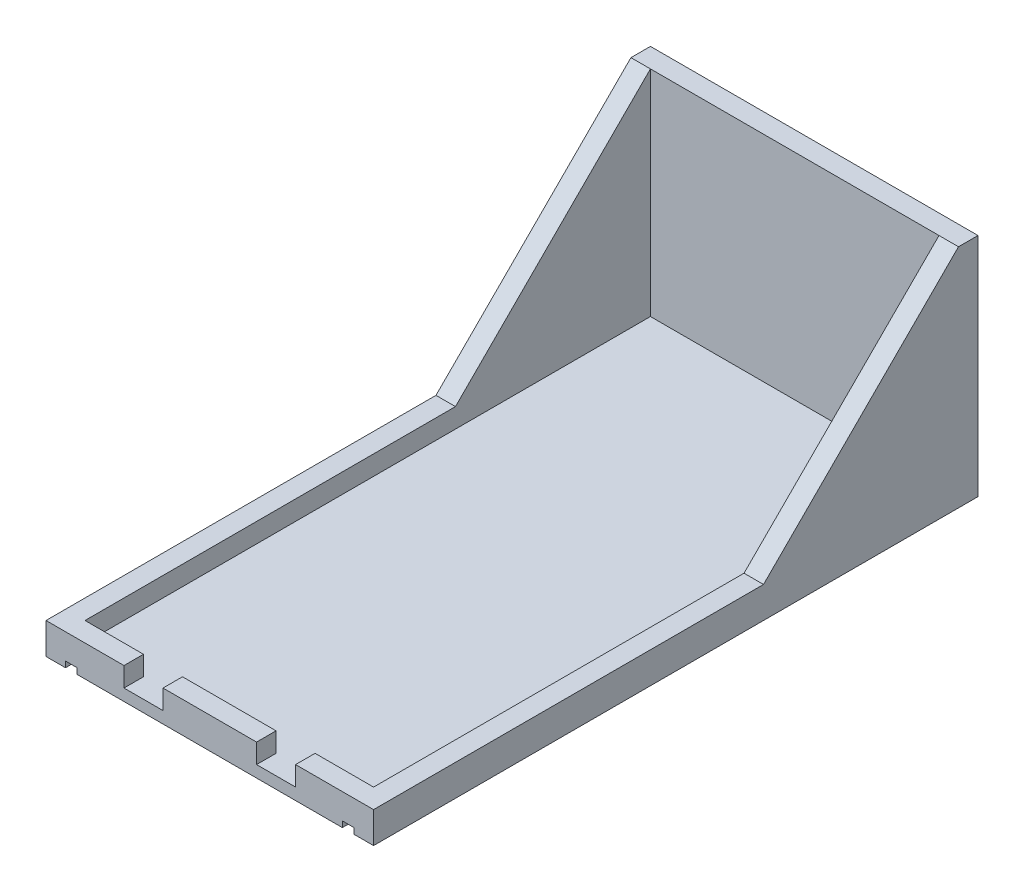
ISO-10303-21;
HEADER;
FILE_DESCRIPTION(('STEP AP214'),'2;1');
FILE_NAME('part.step','',(''),(''),'','','');
FILE_SCHEMA(('AUTOMOTIVE_DESIGN { 1 0 10303 214 1 1 1 1 }'));
ENDSEC;
DATA;
#1=APPLICATION_CONTEXT('core data for automotive mechanical design processes');
#2=APPLICATION_PROTOCOL_DEFINITION('international standard','automotive_design',2000,#1);
#3=PRODUCT_CONTEXT('',#1,'mechanical');
#4=PRODUCT('Part','Part','',(#3));
#5=PRODUCT_RELATED_PRODUCT_CATEGORY('part','',(#4));
#6=PRODUCT_DEFINITION_FORMATION('','',#4);
#7=PRODUCT_DEFINITION_CONTEXT('part definition',#1,'design');
#8=PRODUCT_DEFINITION('design','',#6,#7);
#9=PRODUCT_DEFINITION_SHAPE('','',#8);
#10=(LENGTH_UNIT() NAMED_UNIT(*) SI_UNIT(.MILLI.,.METRE.));
#11=(NAMED_UNIT(*) PLANE_ANGLE_UNIT() SI_UNIT($,.RADIAN.));
#12=(NAMED_UNIT(*) SI_UNIT($,.STERADIAN.) SOLID_ANGLE_UNIT());
#13=UNCERTAINTY_MEASURE_WITH_UNIT(LENGTH_MEASURE(1.E-05),#10,'distance_accuracy_value','');
#14=(GEOMETRIC_REPRESENTATION_CONTEXT(3) GLOBAL_UNCERTAINTY_ASSIGNED_CONTEXT((#13)) GLOBAL_UNIT_ASSIGNED_CONTEXT((#10,
#11,#12)) REPRESENTATION_CONTEXT('',''));
#15=CARTESIAN_POINT('',(0.,0.,0.));
#16=DIRECTION('',(0.,0.,1.));
#17=DIRECTION('',(1.,0.,0.));
#18=AXIS2_PLACEMENT_3D('',#15,#16,#17);
#19=CARTESIAN_POINT('',(37.,0.,72.5));
#20=DIRECTION('',(0.,0.,1.));
#21=DIRECTION('',(1.,0.,0.));
#22=AXIS2_PLACEMENT_3D('',#19,#20,#21);
#23=PLANE('',#22);
#24=DIRECTION('',(1.,0.,0.));
#25=VECTOR('',#24,1.);
#26=CARTESIAN_POINT('',(34.,1.5,72.5));
#27=LINE('',#26,#25);
#28=CARTESIAN_POINT('',(34.,1.5,72.5));
#29=VERTEX_POINT('',#28);
#30=CARTESIAN_POINT('',(37.,1.5,72.5));
#31=VERTEX_POINT('',#30);
#32=EDGE_CURVE('E244',#29,#31,#27,.T.);
#33=ORIENTED_EDGE('',*,*,#32,.F.);
#34=DIRECTION('',(0.,1.,0.));
#35=VECTOR('',#34,1.);
#36=CARTESIAN_POINT('',(34.,0.,72.5));
#37=LINE('',#36,#35);
#38=CARTESIAN_POINT('',(34.,3.,72.5));
#39=VERTEX_POINT('',#38);
#40=EDGE_CURVE('E257',#29,#39,#37,.T.);
#41=ORIENTED_EDGE('',*,*,#40,.T.);
#42=DIRECTION('',(1.,0.,0.));
#43=VECTOR('',#42,1.);
#44=CARTESIAN_POINT('',(0.,3.,72.5));
#45=LINE('',#44,#43);
#46=CARTESIAN_POINT('',(22.,3.,72.5));
#47=VERTEX_POINT('',#46);
#48=EDGE_CURVE('E310',#47,#39,#45,.T.);
#49=ORIENTED_EDGE('',*,*,#48,.F.);
#50=DIRECTION('',(0.,1.,0.));
#51=VECTOR('',#50,1.);
#52=CARTESIAN_POINT('',(22.,3.,72.5));
#53=LINE('',#52,#51);
#54=CARTESIAN_POINT('',(22.,8.,72.5));
#55=VERTEX_POINT('',#54);
#56=EDGE_CURVE('E302',#47,#55,#53,.T.);
#57=ORIENTED_EDGE('',*,*,#56,.T.);
#58=DIRECTION('',(-1.,0.,0.));
#59=VECTOR('',#58,1.);
#60=CARTESIAN_POINT('',(42.,8.,72.5));
#61=LINE('',#60,#59);
#62=CARTESIAN_POINT('',(37.,8.,72.5));
#63=VERTEX_POINT('',#62);
#64=EDGE_CURVE('E254',#63,#55,#61,.T.);
#65=ORIENTED_EDGE('',*,*,#64,.F.);
#66=DIRECTION('',(0.,1.,0.));
#67=VECTOR('',#66,1.);
#68=CARTESIAN_POINT('',(37.,0.,72.5));
#69=LINE('',#68,#67);
#70=EDGE_CURVE('E237',#31,#63,#69,.T.);
#71=ORIENTED_EDGE('',*,*,#70,.F.);
#72=EDGE_LOOP('',(#33,#41,#49,#57,#65,#71));
#73=FACE_BOUND('',#72,.T.);
#74=ADVANCED_FACE('F37',(#73),#23,.F.);
#75=CARTESIAN_POINT('',(42.,8.,-77.5));
#76=DIRECTION('',(0.,1.,0.));
#77=DIRECTION('',(0.,0.,1.));
#78=AXIS2_PLACEMENT_3D('',#75,#76,#77);
#79=PLANE('',#78);
#80=DIRECTION('',(0.,0.,-1.));
#81=VECTOR('',#80,1.);
#82=CARTESIAN_POINT('',(22.,8.,-77.5));
#83=LINE('',#82,#81);
#84=CARTESIAN_POINT('',(22.,8.,77.5));
#85=VERTEX_POINT('',#84);
#86=EDGE_CURVE('E45',#85,#55,#83,.T.);
#87=ORIENTED_EDGE('',*,*,#86,.F.);
#88=DIRECTION('',(-1.,0.,0.));
#89=VECTOR('',#88,1.);
#90=CARTESIAN_POINT('',(42.,8.,77.5));
#91=LINE('',#90,#89);
#92=CARTESIAN_POINT('',(42.,8.,77.5));
#93=VERTEX_POINT('',#92);
#94=EDGE_CURVE('E415',#93,#85,#91,.T.);
#95=ORIENTED_EDGE('',*,*,#94,.F.);
#96=DIRECTION('',(0.,0.,1.));
#97=VECTOR('',#96,1.);
#98=CARTESIAN_POINT('',(42.,8.,-77.5));
#99=LINE('',#98,#97);
#100=CARTESIAN_POINT('',(42.,8.,-22.5000000000009));
#101=VERTEX_POINT('',#100);
#102=EDGE_CURVE('E416',#101,#93,#99,.T.);
#103=ORIENTED_EDGE('',*,*,#102,.F.);
#104=DIRECTION('',(1.,0.,0.));
#105=VECTOR('',#104,1.);
#106=CARTESIAN_POINT('',(42.,8.,-22.5000000000009));
#107=LINE('',#106,#105);
#108=CARTESIAN_POINT('',(37.,8.,-22.5000000000009));
#109=VERTEX_POINT('',#108);
#110=EDGE_CURVE('E466',#109,#101,#107,.T.);
#111=ORIENTED_EDGE('',*,*,#110,.F.);
#112=DIRECTION('',(0.,0.,1.));
#113=VECTOR('',#112,1.);
#114=CARTESIAN_POINT('',(37.,8.,-77.5));
#115=LINE('',#114,#113);
#116=EDGE_CURVE('E314',#109,#63,#115,.T.);
#117=ORIENTED_EDGE('',*,*,#116,.T.);
#118=ORIENTED_EDGE('',*,*,#64,.T.);
#119=EDGE_LOOP('',(#87,#95,#103,#111,#117,#118));
#120=FACE_BOUND('',#119,.T.);
#121=ADVANCED_FACE('F313',(#120),#79,.T.);
#122=DIRECTION('',(1.,0.,0.));
#123=VECTOR('',#122,1.);
#124=CARTESIAN_POINT('',(-37.,0.,72.5));
#125=LINE('',#124,#123);
#126=CARTESIAN_POINT('',(-34.0086997071722,0.,72.5));
#127=VERTEX_POINT('',#126);
#128=CARTESIAN_POINT('',(-34.,0.,72.5));
#129=VERTEX_POINT('',#128);
#130=EDGE_CURVE('E553',#127,#129,#125,.T.);
#131=ORIENTED_EDGE('',*,*,#130,.F.);
#132=DIRECTION('',(0.,-1.,0.));
#133=VECTOR('',#132,1.);
#134=CARTESIAN_POINT('',(-34.0086997071722,1.5,72.5));
#135=LINE('',#134,#133);
#136=CARTESIAN_POINT('',(-34.0086997071722,1.5,72.5));
#137=VERTEX_POINT('',#136);
#138=EDGE_CURVE('E52',#137,#127,#135,.T.);
#139=ORIENTED_EDGE('',*,*,#138,.F.);
#140=DIRECTION('',(1.,0.,0.));
#141=VECTOR('',#140,1.);
#142=CARTESIAN_POINT('',(-37.,1.5,72.5));
#143=LINE('',#142,#141);
#144=CARTESIAN_POINT('',(-37.,1.5,72.5));
#145=VERTEX_POINT('',#144);
#146=EDGE_CURVE('E377',#145,#137,#143,.T.);
#147=ORIENTED_EDGE('',*,*,#146,.F.);
#148=DIRECTION('',(0.,1.,0.));
#149=VECTOR('',#148,1.);
#150=CARTESIAN_POINT('',(-37.,0.,72.5));
#151=LINE('',#150,#149);
#152=CARTESIAN_POINT('',(-37.,8.,72.5));
#153=VERTEX_POINT('',#152);
#154=EDGE_CURVE('E557',#145,#153,#151,.T.);
#155=ORIENTED_EDGE('',*,*,#154,.T.);
#156=CARTESIAN_POINT('',(-22.,8.,72.5));
#157=VERTEX_POINT('',#156);
#158=EDGE_CURVE('E317',#157,#153,#61,.T.);
#159=ORIENTED_EDGE('',*,*,#158,.F.);
#160=DIRECTION('',(0.,-1.,0.));
#161=VECTOR('',#160,1.);
#162=CARTESIAN_POINT('',(-22.,3.,72.5));
#163=LINE('',#162,#161);
#164=CARTESIAN_POINT('',(-22.,3.,72.5));
#165=VERTEX_POINT('',#164);
#166=EDGE_CURVE('E340',#157,#165,#163,.T.);
#167=ORIENTED_EDGE('',*,*,#166,.T.);
#168=CARTESIAN_POINT('',(-34.,3.,72.5));
#169=VERTEX_POINT('',#168);
#170=EDGE_CURVE('E320',#169,#165,#45,.T.);
#171=ORIENTED_EDGE('',*,*,#170,.F.);
#172=DIRECTION('',(0.,1.,0.));
#173=VECTOR('',#172,1.);
#174=CARTESIAN_POINT('',(-34.,0.,72.5));
#175=LINE('',#174,#173);
#176=EDGE_CURVE('E562',#129,#169,#175,.T.);
#177=ORIENTED_EDGE('',*,*,#176,.F.);
#178=EDGE_LOOP('',(#131,#139,#147,#155,#159,#167,#171,#177));
#179=FACE_BOUND('',#178,.T.);
#180=ADVANCED_FACE('F501',(#179),#23,.F.);
#181=DIRECTION('',(0.,0.,1.));
#182=VECTOR('',#181,1.);
#183=CARTESIAN_POINT('',(-22.,8.,-77.5));
#184=LINE('',#183,#182);
#185=CARTESIAN_POINT('',(-22.,8.,77.5));
#186=VERTEX_POINT('',#185);
#187=EDGE_CURVE('E295',#157,#186,#184,.T.);
#188=ORIENTED_EDGE('',*,*,#187,.F.);
#189=ORIENTED_EDGE('',*,*,#158,.T.);
#190=DIRECTION('',(0.,0.,1.));
#191=VECTOR('',#190,1.);
#192=CARTESIAN_POINT('',(-37.,8.,-77.5));
#193=LINE('',#192,#191);
#194=CARTESIAN_POINT('',(-37.,8.,-22.4999999999988));
#195=VERTEX_POINT('',#194);
#196=EDGE_CURVE('E433',#195,#153,#193,.T.);
#197=ORIENTED_EDGE('',*,*,#196,.F.);
#198=DIRECTION('',(-1.,0.,0.));
#199=VECTOR('',#198,1.);
#200=CARTESIAN_POINT('',(-37.,8.,-22.4999999999988));
#201=LINE('',#200,#199);
#202=CARTESIAN_POINT('',(-42.,8.,-22.4999999999988));
#203=VERTEX_POINT('',#202);
#204=EDGE_CURVE('E458',#195,#203,#201,.T.);
#205=ORIENTED_EDGE('',*,*,#204,.T.);
#206=DIRECTION('',(0.,0.,1.));
#207=VECTOR('',#206,1.);
#208=CARTESIAN_POINT('',(-42.,8.,-77.5));
#209=LINE('',#208,#207);
#210=CARTESIAN_POINT('',(-42.,8.,77.5));
#211=VERTEX_POINT('',#210);
#212=EDGE_CURVE('E428',#203,#211,#209,.T.);
#213=ORIENTED_EDGE('',*,*,#212,.T.);
#214=EDGE_CURVE('E419',#186,#211,#91,.T.);
#215=ORIENTED_EDGE('',*,*,#214,.F.);
#216=EDGE_LOOP('',(#188,#189,#197,#205,#213,#215));
#217=FACE_BOUND('',#216,.T.);
#218=ADVANCED_FACE('F506',(#217),#79,.T.);
#219=CARTESIAN_POINT('',(0.,3.,0.));
#220=DIRECTION('',(0.,1.,0.));
#221=DIRECTION('',(0.,0.,1.));
#222=AXIS2_PLACEMENT_3D('',#219,#220,#221);
#223=PLANE('',#222);
#224=DIRECTION('',(0.,0.,-1.));
#225=VECTOR('',#224,1.);
#226=CARTESIAN_POINT('',(-34.,3.,69.5));
#227=LINE('',#226,#225);
#228=CARTESIAN_POINT('',(-34.,3.,69.5));
#229=VERTEX_POINT('',#228);
#230=EDGE_CURVE('E570',#169,#229,#227,.T.);
#231=ORIENTED_EDGE('',*,*,#230,.F.);
#232=ORIENTED_EDGE('',*,*,#170,.T.);
#233=DIRECTION('',(0.,0.,1.));
#234=VECTOR('',#233,1.);
#235=CARTESIAN_POINT('',(-22.,3.,72.5));
#236=LINE('',#235,#234);
#237=CARTESIAN_POINT('',(-22.,3.,77.5));
#238=VERTEX_POINT('',#237);
#239=EDGE_CURVE('E329',#165,#238,#236,.T.);
#240=ORIENTED_EDGE('',*,*,#239,.T.);
#241=DIRECTION('',(1.,0.,0.));
#242=VECTOR('',#241,1.);
#243=CARTESIAN_POINT('',(-22.,3.,77.5));
#244=LINE('',#243,#242);
#245=CARTESIAN_POINT('',(-12.,3.,77.5));
#246=VERTEX_POINT('',#245);
#247=EDGE_CURVE('E341',#238,#246,#244,.T.);
#248=ORIENTED_EDGE('',*,*,#247,.T.);
#249=DIRECTION('',(0.,0.,1.));
#250=VECTOR('',#249,1.);
#251=CARTESIAN_POINT('',(-12.,3.,72.5));
#252=LINE('',#251,#250);
#253=CARTESIAN_POINT('',(-12.,3.,72.5));
#254=VERTEX_POINT('',#253);
#255=EDGE_CURVE('E323',#254,#246,#252,.T.);
#256=ORIENTED_EDGE('',*,*,#255,.F.);
#257=CARTESIAN_POINT('',(12.,3.,72.5));
#258=VERTEX_POINT('',#257);
#259=EDGE_CURVE('E318',#254,#258,#45,.T.);
#260=ORIENTED_EDGE('',*,*,#259,.T.);
#261=DIRECTION('',(0.,0.,1.));
#262=VECTOR('',#261,1.);
#263=CARTESIAN_POINT('',(12.,3.,72.5));
#264=LINE('',#263,#262);
#265=CARTESIAN_POINT('',(12.,3.,77.5));
#266=VERTEX_POINT('',#265);
#267=EDGE_CURVE('E350',#258,#266,#264,.T.);
#268=ORIENTED_EDGE('',*,*,#267,.T.);
#269=DIRECTION('',(1.,0.,0.));
#270=VECTOR('',#269,1.);
#271=CARTESIAN_POINT('',(22.,3.,77.5));
#272=LINE('',#271,#270);
#273=CARTESIAN_POINT('',(22.,3.,77.5));
#274=VERTEX_POINT('',#273);
#275=EDGE_CURVE('E311',#266,#274,#272,.T.);
#276=ORIENTED_EDGE('',*,*,#275,.T.);
#277=DIRECTION('',(0.,0.,1.));
#278=VECTOR('',#277,1.);
#279=CARTESIAN_POINT('',(22.,3.,72.5));
#280=LINE('',#279,#278);
#281=EDGE_CURVE('E345',#47,#274,#280,.T.);
#282=ORIENTED_EDGE('',*,*,#281,.F.);
#283=ORIENTED_EDGE('',*,*,#48,.T.);
#284=DIRECTION('',(0.,0.,1.));
#285=VECTOR('',#284,1.);
#286=CARTESIAN_POINT('',(34.,3.,72.5));
#287=LINE('',#286,#285);
#288=CARTESIAN_POINT('',(34.,3.,69.5));
#289=VERTEX_POINT('',#288);
#290=EDGE_CURVE('E264',#289,#39,#287,.T.);
#291=ORIENTED_EDGE('',*,*,#290,.F.);
#292=DIRECTION('',(-1.,0.,0.));
#293=VECTOR('',#292,1.);
#294=CARTESIAN_POINT('',(37.,3.,69.5));
#295=LINE('',#294,#293);
#296=CARTESIAN_POINT('',(37.,3.,69.5));
#297=VERTEX_POINT('',#296);
#298=EDGE_CURVE('E578',#297,#289,#295,.T.);
#299=ORIENTED_EDGE('',*,*,#298,.F.);
#300=DIRECTION('',(0.,0.,1.));
#301=VECTOR('',#300,1.);
#302=CARTESIAN_POINT('',(37.,3.,0.));
#303=LINE('',#302,#301);
#304=CARTESIAN_POINT('',(37.,3.,-72.5));
#305=VERTEX_POINT('',#304);
#306=EDGE_CURVE('E573',#305,#297,#303,.T.);
#307=ORIENTED_EDGE('',*,*,#306,.F.);
#308=DIRECTION('',(1.,0.,0.));
#309=VECTOR('',#308,1.);
#310=CARTESIAN_POINT('',(0.,3.,-72.5));
#311=LINE('',#310,#309);
#312=CARTESIAN_POINT('',(-37.,3.,-72.5));
#313=VERTEX_POINT('',#312);
#314=EDGE_CURVE('E439',#313,#305,#311,.T.);
#315=ORIENTED_EDGE('',*,*,#314,.F.);
#316=DIRECTION('',(0.,0.,-1.));
#317=VECTOR('',#316,1.);
#318=CARTESIAN_POINT('',(-37.,3.,0.));
#319=LINE('',#318,#317);
#320=CARTESIAN_POINT('',(-37.,3.,69.5));
#321=VERTEX_POINT('',#320);
#322=EDGE_CURVE('E423',#321,#313,#319,.T.);
#323=ORIENTED_EDGE('',*,*,#322,.F.);
#324=DIRECTION('',(-1.,0.,0.));
#325=VECTOR('',#324,1.);
#326=CARTESIAN_POINT('',(-37.,3.,69.5));
#327=LINE('',#326,#325);
#328=EDGE_CURVE('E554',#229,#321,#327,.T.);
#329=ORIENTED_EDGE('',*,*,#328,.F.);
#330=EDGE_LOOP('',(#231,#232,#240,#248,#256,#260,#268,#276,#282,#283,#291,#299,#307,#315,#323,#329));
#331=FACE_BOUND('',#330,.T.);
#332=ADVANCED_FACE('F410',(#331),#223,.T.);
#333=CARTESIAN_POINT('',(37.,0.,72.5));
#334=DIRECTION('',(1.,0.,0.));
#335=DIRECTION('',(0.,0.,-1.));
#336=AXIS2_PLACEMENT_3D('',#333,#334,#335);
#337=PLANE('',#336);
#338=DIRECTION('',(0.,0.,-1.));
#339=VECTOR('',#338,1.);
#340=CARTESIAN_POINT('',(37.,0.,72.5));
#341=LINE('',#340,#339);
#342=CARTESIAN_POINT('',(37.,0.,77.5));
#343=VERTEX_POINT('',#342);
#344=CARTESIAN_POINT('',(37.,0.,69.5));
#345=VERTEX_POINT('',#344);
#346=EDGE_CURVE('E394',#343,#345,#341,.T.);
#347=ORIENTED_EDGE('',*,*,#346,.F.);
#348=DIRECTION('',(0.,-1.,0.));
#349=VECTOR('',#348,1.);
#350=CARTESIAN_POINT('',(37.,3.,77.5));
#351=LINE('',#350,#349);
#352=CARTESIAN_POINT('',(37.,1.5,77.5));
#353=VERTEX_POINT('',#352);
#354=EDGE_CURVE('E240',#353,#343,#351,.T.);
#355=ORIENTED_EDGE('',*,*,#354,.F.);
#356=DIRECTION('',(0.,0.,1.));
#357=VECTOR('',#356,1.);
#358=CARTESIAN_POINT('',(37.,1.5,72.5));
#359=LINE('',#358,#357);
#360=EDGE_CURVE('E232',#31,#353,#359,.T.);
#361=ORIENTED_EDGE('',*,*,#360,.F.);
#362=ORIENTED_EDGE('',*,*,#70,.T.);
#363=ORIENTED_EDGE('',*,*,#116,.F.);
#364=DIRECTION('',(0.,-0.707106781186554,0.707106781186541));
#365=VECTOR('',#364,1.);
#366=CARTESIAN_POINT('',(37.,58.,-72.5));
#367=LINE('',#366,#365);
#368=CARTESIAN_POINT('',(37.,58.,-72.5));
#369=VERTEX_POINT('',#368);
#370=EDGE_CURVE('E471',#369,#109,#367,.T.);
#371=ORIENTED_EDGE('',*,*,#370,.F.);
#372=DIRECTION('',(0.,-1.,0.));
#373=VECTOR('',#372,1.);
#374=CARTESIAN_POINT('',(37.,0.,-72.5));
#375=LINE('',#374,#373);
#376=EDGE_CURVE('E436',#369,#305,#375,.T.);
#377=ORIENTED_EDGE('',*,*,#376,.T.);
#378=ORIENTED_EDGE('',*,*,#306,.T.);
#379=DIRECTION('',(0.,1.,0.));
#380=VECTOR('',#379,1.);
#381=CARTESIAN_POINT('',(37.,0.,69.5));
#382=LINE('',#381,#380);
#383=EDGE_CURVE('E268',#345,#297,#382,.T.);
#384=ORIENTED_EDGE('',*,*,#383,.F.);
#385=EDGE_LOOP('',(#347,#355,#361,#362,#363,#371,#377,#378,#384));
#386=FACE_BOUND('',#385,.T.);
#387=ADVANCED_FACE('F234',(#386),#337,.F.);
#388=CARTESIAN_POINT('',(-37.,0.,69.5));
#389=DIRECTION('',(-1.,0.,0.));
#390=DIRECTION('',(0.,0.,1.));
#391=AXIS2_PLACEMENT_3D('',#388,#389,#390);
#392=PLANE('',#391);
#393=ORIENTED_EDGE('',*,*,#196,.T.);
#394=ORIENTED_EDGE('',*,*,#154,.F.);
#395=DIRECTION('',(0.,0.,-1.));
#396=VECTOR('',#395,1.);
#397=CARTESIAN_POINT('',(-37.,1.5,72.5));
#398=LINE('',#397,#396);
#399=CARTESIAN_POINT('',(-37.,1.5,77.5));
#400=VERTEX_POINT('',#399);
#401=EDGE_CURVE('E370',#400,#145,#398,.T.);
#402=ORIENTED_EDGE('',*,*,#401,.F.);
#403=DIRECTION('',(0.,-1.,0.));
#404=VECTOR('',#403,1.);
#405=CARTESIAN_POINT('',(-37.,1.5,77.5));
#406=LINE('',#405,#404);
#407=CARTESIAN_POINT('',(-37.,0.,77.5));
#408=VERTEX_POINT('',#407);
#409=EDGE_CURVE('E359',#400,#408,#406,.T.);
#410=ORIENTED_EDGE('',*,*,#409,.T.);
#411=DIRECTION('',(0.,0.,1.));
#412=VECTOR('',#411,1.);
#413=CARTESIAN_POINT('',(-37.,0.,69.5));
#414=LINE('',#413,#412);
#415=CARTESIAN_POINT('',(-37.,0.,69.5));
#416=VERTEX_POINT('',#415);
#417=EDGE_CURVE('E549',#416,#408,#414,.T.);
#418=ORIENTED_EDGE('',*,*,#417,.F.);
#419=DIRECTION('',(0.,1.,0.));
#420=VECTOR('',#419,1.);
#421=CARTESIAN_POINT('',(-37.,0.,69.5));
#422=LINE('',#421,#420);
#423=EDGE_CURVE('E576',#416,#321,#422,.T.);
#424=ORIENTED_EDGE('',*,*,#423,.T.);
#425=ORIENTED_EDGE('',*,*,#322,.T.);
#426=DIRECTION('',(0.,1.,0.));
#427=VECTOR('',#426,1.);
#428=CARTESIAN_POINT('',(-37.,0.,-72.5));
#429=LINE('',#428,#427);
#430=CARTESIAN_POINT('',(-37.,58.,-72.5));
#431=VERTEX_POINT('',#430);
#432=EDGE_CURVE('E442',#313,#431,#429,.T.);
#433=ORIENTED_EDGE('',*,*,#432,.T.);
#434=DIRECTION('',(0.,0.707106781186539,-0.707106781186556));
#435=VECTOR('',#434,1.);
#436=CARTESIAN_POINT('',(-37.,58.,-72.5));
#437=LINE('',#436,#435);
#438=EDGE_CURVE('E461',#195,#431,#437,.T.);
#439=ORIENTED_EDGE('',*,*,#438,.F.);
#440=EDGE_LOOP('',(#393,#394,#402,#410,#418,#424,#425,#433,#439));
#441=FACE_BOUND('',#440,.T.);
#442=ADVANCED_FACE('F539',(#441),#392,.F.);
#443=CARTESIAN_POINT('',(42.,0.,-72.5));
#444=DIRECTION('',(0.,0.,1.));
#445=DIRECTION('',(1.,0.,0.));
#446=AXIS2_PLACEMENT_3D('',#443,#444,#445);
#447=PLANE('',#446);
#448=ORIENTED_EDGE('',*,*,#376,.F.);
#449=DIRECTION('',(-1.,0.,0.));
#450=VECTOR('',#449,1.);
#451=CARTESIAN_POINT('',(42.,58.,-72.5));
#452=LINE('',#451,#450);
#453=EDGE_CURVE('E448',#369,#431,#452,.T.);
#454=ORIENTED_EDGE('',*,*,#453,.T.);
#455=ORIENTED_EDGE('',*,*,#432,.F.);
#456=ORIENTED_EDGE('',*,*,#314,.T.);
#457=EDGE_LOOP('',(#448,#454,#455,#456));
#458=FACE_BOUND('',#457,.T.);
#459=ADVANCED_FACE('F534',(#458),#447,.T.);
#460=CARTESIAN_POINT('',(-42.,3.,77.5));
#461=DIRECTION('',(1.,0.,0.));
#462=DIRECTION('',(0.,0.,-1.));
#463=AXIS2_PLACEMENT_3D('',#460,#461,#462);
#464=PLANE('',#463);
#465=DIRECTION('',(0.,-1.,0.));
#466=VECTOR('',#465,1.);
#467=CARTESIAN_POINT('',(-42.,3.,77.5));
#468=LINE('',#467,#466);
#469=CARTESIAN_POINT('',(-42.,0.,77.5));
#470=VERTEX_POINT('',#469);
#471=EDGE_CURVE('E289',#211,#470,#468,.T.);
#472=ORIENTED_EDGE('',*,*,#471,.F.);
#473=ORIENTED_EDGE('',*,*,#212,.F.);
#474=DIRECTION('',(0.,0.707106781186539,-0.707106781186556));
#475=VECTOR('',#474,1.);
#476=CARTESIAN_POINT('',(-42.,58.,-72.5));
#477=LINE('',#476,#475);
#478=CARTESIAN_POINT('',(-42.,58.,-72.5));
#479=VERTEX_POINT('',#478);
#480=EDGE_CURVE('E464',#203,#479,#477,.T.);
#481=ORIENTED_EDGE('',*,*,#480,.T.);
#482=DIRECTION('',(0.,0.,-1.));
#483=VECTOR('',#482,1.);
#484=CARTESIAN_POINT('',(-42.,58.,-77.5));
#485=LINE('',#484,#483);
#486=CARTESIAN_POINT('',(-42.,58.,-77.5));
#487=VERTEX_POINT('',#486);
#488=EDGE_CURVE('E451',#479,#487,#485,.T.);
#489=ORIENTED_EDGE('',*,*,#488,.T.);
#490=DIRECTION('',(0.,-1.,0.));
#491=VECTOR('',#490,1.);
#492=CARTESIAN_POINT('',(-42.,3.,-77.5));
#493=LINE('',#492,#491);
#494=CARTESIAN_POINT('',(-42.,0.,-77.5));
#495=VERTEX_POINT('',#494);
#496=EDGE_CURVE('E280',#487,#495,#493,.T.);
#497=ORIENTED_EDGE('',*,*,#496,.T.);
#498=DIRECTION('',(0.,0.,1.));
#499=VECTOR('',#498,1.);
#500=CARTESIAN_POINT('',(-42.,0.,77.5));
#501=LINE('',#500,#499);
#502=EDGE_CURVE('E256',#495,#470,#501,.T.);
#503=ORIENTED_EDGE('',*,*,#502,.T.);
#504=EDGE_LOOP('',(#472,#473,#481,#489,#497,#503));
#505=FACE_BOUND('',#504,.T.);
#506=ADVANCED_FACE('F39',(#505),#464,.F.);
#507=CARTESIAN_POINT('',(42.,3.,77.5));
#508=DIRECTION('',(0.,0.,-1.));
#509=DIRECTION('',(-1.,0.,0.));
#510=AXIS2_PLACEMENT_3D('',#507,#508,#509);
#511=PLANE('',#510);
#512=DIRECTION('',(1.,0.,0.));
#513=VECTOR('',#512,1.);
#514=CARTESIAN_POINT('',(42.,0.,77.5));
#515=LINE('',#514,#513);
#516=CARTESIAN_POINT('',(-34.0086997071722,0.,77.5));
#517=VERTEX_POINT('',#516);
#518=CARTESIAN_POINT('',(34.,0.,77.5));
#519=VERTEX_POINT('',#518);
#520=EDGE_CURVE('E276',#517,#519,#515,.T.);
#521=ORIENTED_EDGE('',*,*,#520,.T.);
#522=DIRECTION('',(0.,1.,0.));
#523=VECTOR('',#522,1.);
#524=CARTESIAN_POINT('',(34.,3.,77.5));
#525=LINE('',#524,#523);
#526=CARTESIAN_POINT('',(34.,1.5,77.5));
#527=VERTEX_POINT('',#526);
#528=EDGE_CURVE('E371',#519,#527,#525,.T.);
#529=ORIENTED_EDGE('',*,*,#528,.T.);
#530=DIRECTION('',(-1.,0.,0.));
#531=VECTOR('',#530,1.);
#532=CARTESIAN_POINT('',(42.,1.5,77.5));
#533=LINE('',#532,#531);
#534=EDGE_CURVE('E11',#353,#527,#533,.T.);
#535=ORIENTED_EDGE('',*,*,#534,.F.);
#536=ORIENTED_EDGE('',*,*,#354,.T.);
#537=CARTESIAN_POINT('',(42.,0.,77.5));
#538=VERTEX_POINT('',#537);
#539=EDGE_CURVE('E259',#343,#538,#515,.T.);
#540=ORIENTED_EDGE('',*,*,#539,.T.);
#541=DIRECTION('',(0.,-1.,0.));
#542=VECTOR('',#541,1.);
#543=CARTESIAN_POINT('',(42.,3.,77.5));
#544=LINE('',#543,#542);
#545=EDGE_CURVE('E286',#93,#538,#544,.T.);
#546=ORIENTED_EDGE('',*,*,#545,.F.);
#547=ORIENTED_EDGE('',*,*,#94,.T.);
#548=DIRECTION('',(0.,1.,0.));
#549=VECTOR('',#548,1.);
#550=CARTESIAN_POINT('',(22.,3.,77.5));
#551=LINE('',#550,#549);
#552=EDGE_CURVE('E305',#274,#85,#551,.T.);
#553=ORIENTED_EDGE('',*,*,#552,.F.);
#554=ORIENTED_EDGE('',*,*,#275,.F.);
#555=DIRECTION('',(0.,-1.,0.));
#556=VECTOR('',#555,1.);
#557=CARTESIAN_POINT('',(12.,3.,77.5));
#558=LINE('',#557,#556);
#559=CARTESIAN_POINT('',(12.,8.,77.5));
#560=VERTEX_POINT('',#559);
#561=EDGE_CURVE('E356',#560,#266,#558,.T.);
#562=ORIENTED_EDGE('',*,*,#561,.F.);
#563=CARTESIAN_POINT('',(-12.,8.,77.5));
#564=VERTEX_POINT('',#563);
#565=EDGE_CURVE('E417',#560,#564,#91,.T.);
#566=ORIENTED_EDGE('',*,*,#565,.T.);
#567=DIRECTION('',(0.,1.,0.));
#568=VECTOR('',#567,1.);
#569=CARTESIAN_POINT('',(-12.,3.,77.5));
#570=LINE('',#569,#568);
#571=EDGE_CURVE('E338',#246,#564,#570,.T.);
#572=ORIENTED_EDGE('',*,*,#571,.F.);
#573=ORIENTED_EDGE('',*,*,#247,.F.);
#574=DIRECTION('',(0.,-1.,0.));
#575=VECTOR('',#574,1.);
#576=CARTESIAN_POINT('',(-22.,3.,77.5));
#577=LINE('',#576,#575);
#578=EDGE_CURVE('E343',#186,#238,#577,.T.);
#579=ORIENTED_EDGE('',*,*,#578,.F.);
#580=ORIENTED_EDGE('',*,*,#214,.T.);
#581=ORIENTED_EDGE('',*,*,#471,.T.);
#582=EDGE_CURVE('E272',#470,#408,#515,.T.);
#583=ORIENTED_EDGE('',*,*,#582,.T.);
#584=ORIENTED_EDGE('',*,*,#409,.F.);
#585=DIRECTION('',(-1.,0.,0.));
#586=VECTOR('',#585,1.);
#587=CARTESIAN_POINT('',(-37.,1.5,77.5));
#588=LINE('',#587,#586);
#589=CARTESIAN_POINT('',(-34.0086997071722,1.5,77.5));
#590=VERTEX_POINT('',#589);
#591=EDGE_CURVE('E363',#590,#400,#588,.T.);
#592=ORIENTED_EDGE('',*,*,#591,.F.);
#593=DIRECTION('',(0.,-1.,0.));
#594=VECTOR('',#593,1.);
#595=CARTESIAN_POINT('',(-34.0086997071722,1.5,77.5));
#596=LINE('',#595,#594);
#597=EDGE_CURVE('E362',#590,#517,#596,.T.);
#598=ORIENTED_EDGE('',*,*,#597,.T.);
#599=EDGE_LOOP('',(#521,#529,#535,#536,#540,#546,#547,#553,#554,#562,#566,#572,#573,#579,#580,
#581,#583,#584,#592,#598));
#600=FACE_BOUND('',#599,.T.);
#601=ADVANCED_FACE('F387',(#600),#511,.F.);
#602=CARTESIAN_POINT('',(42.,3.,77.5));
#603=DIRECTION('',(-1.,0.,0.));
#604=DIRECTION('',(0.,0.,1.));
#605=AXIS2_PLACEMENT_3D('',#602,#603,#604);
#606=PLANE('',#605);
#607=DIRECTION('',(0.,0.,-1.));
#608=VECTOR('',#607,1.);
#609=CARTESIAN_POINT('',(42.,0.,77.5));
#610=LINE('',#609,#608);
#611=CARTESIAN_POINT('',(42.,0.,-77.5));
#612=VERTEX_POINT('',#611);
#613=EDGE_CURVE('E275',#538,#612,#610,.T.);
#614=ORIENTED_EDGE('',*,*,#613,.T.);
#615=DIRECTION('',(0.,-1.,0.));
#616=VECTOR('',#615,1.);
#617=CARTESIAN_POINT('',(42.,3.,-77.5));
#618=LINE('',#617,#616);
#619=CARTESIAN_POINT('',(42.,58.,-77.5));
#620=VERTEX_POINT('',#619);
#621=EDGE_CURVE('E283',#620,#612,#618,.T.);
#622=ORIENTED_EDGE('',*,*,#621,.F.);
#623=DIRECTION('',(0.,0.,-1.));
#624=VECTOR('',#623,1.);
#625=CARTESIAN_POINT('',(42.,58.,-77.5));
#626=LINE('',#625,#624);
#627=CARTESIAN_POINT('',(42.,58.,-72.5));
#628=VERTEX_POINT('',#627);
#629=EDGE_CURVE('E454',#628,#620,#626,.T.);
#630=ORIENTED_EDGE('',*,*,#629,.F.);
#631=DIRECTION('',(0.,-0.707106781186554,0.707106781186541));
#632=VECTOR('',#631,1.);
#633=CARTESIAN_POINT('',(42.,58.,-72.5));
#634=LINE('',#633,#632);
#635=EDGE_CURVE('E472',#628,#101,#634,.T.);
#636=ORIENTED_EDGE('',*,*,#635,.T.);
#637=ORIENTED_EDGE('',*,*,#102,.T.);
#638=ORIENTED_EDGE('',*,*,#545,.T.);
#639=EDGE_LOOP('',(#614,#622,#630,#636,#637,#638));
#640=FACE_BOUND('',#639,.T.);
#641=ADVANCED_FACE('F522',(#640),#606,.F.);
#642=CARTESIAN_POINT('',(42.,3.,-77.5));
#643=DIRECTION('',(0.,0.,1.));
#644=DIRECTION('',(1.,0.,0.));
#645=AXIS2_PLACEMENT_3D('',#642,#643,#644);
#646=PLANE('',#645);
#647=DIRECTION('',(-1.,0.,0.));
#648=VECTOR('',#647,1.);
#649=CARTESIAN_POINT('',(42.,0.,-77.5));
#650=LINE('',#649,#648);
#651=EDGE_CURVE('E278',#612,#495,#650,.T.);
#652=ORIENTED_EDGE('',*,*,#651,.T.);
#653=ORIENTED_EDGE('',*,*,#496,.F.);
#654=DIRECTION('',(-1.,0.,0.));
#655=VECTOR('',#654,1.);
#656=CARTESIAN_POINT('',(42.,58.,-77.5));
#657=LINE('',#656,#655);
#658=EDGE_CURVE('E444',#620,#487,#657,.T.);
#659=ORIENTED_EDGE('',*,*,#658,.F.);
#660=ORIENTED_EDGE('',*,*,#621,.T.);
#661=EDGE_LOOP('',(#652,#653,#659,#660));
#662=FACE_BOUND('',#661,.T.);
#663=ADVANCED_FACE('F517',(#662),#646,.F.);
#664=CARTESIAN_POINT('',(0.,0.,0.));
#665=DIRECTION('',(0.,1.,0.));
#666=DIRECTION('',(0.,0.,1.));
#667=AXIS2_PLACEMENT_3D('',#664,#665,#666);
#668=PLANE('',#667);
#669=DIRECTION('',(0.,0.,1.));
#670=VECTOR('',#669,1.);
#671=CARTESIAN_POINT('',(34.,0.,72.5));
#672=LINE('',#671,#670);
#673=CARTESIAN_POINT('',(34.,0.,69.5));
#674=VERTEX_POINT('',#673);
#675=EDGE_CURVE('E270',#674,#519,#672,.T.);
#676=ORIENTED_EDGE('',*,*,#675,.T.);
#677=ORIENTED_EDGE('',*,*,#520,.F.);
#678=DIRECTION('',(0.,0.,1.));
#679=VECTOR('',#678,1.);
#680=CARTESIAN_POINT('',(-34.0086997071722,0.,72.5));
#681=LINE('',#680,#679);
#682=EDGE_CURVE('E368',#127,#517,#681,.T.);
#683=ORIENTED_EDGE('',*,*,#682,.F.);
#684=ORIENTED_EDGE('',*,*,#130,.T.);
#685=DIRECTION('',(0.,0.,-1.));
#686=VECTOR('',#685,1.);
#687=CARTESIAN_POINT('',(-34.,0.,69.5));
#688=LINE('',#687,#686);
#689=CARTESIAN_POINT('',(-34.,0.,69.5));
#690=VERTEX_POINT('',#689);
#691=EDGE_CURVE('E564',#129,#690,#688,.T.);
#692=ORIENTED_EDGE('',*,*,#691,.T.);
#693=DIRECTION('',(-1.,0.,0.));
#694=VECTOR('',#693,1.);
#695=CARTESIAN_POINT('',(-37.,0.,69.5));
#696=LINE('',#695,#694);
#697=EDGE_CURVE('E552',#690,#416,#696,.T.);
#698=ORIENTED_EDGE('',*,*,#697,.T.);
#699=ORIENTED_EDGE('',*,*,#417,.T.);
#700=ORIENTED_EDGE('',*,*,#582,.F.);
#701=ORIENTED_EDGE('',*,*,#502,.F.);
#702=ORIENTED_EDGE('',*,*,#651,.F.);
#703=ORIENTED_EDGE('',*,*,#613,.F.);
#704=ORIENTED_EDGE('',*,*,#539,.F.);
#705=ORIENTED_EDGE('',*,*,#346,.T.);
#706=DIRECTION('',(-1.,0.,0.));
#707=VECTOR('',#706,1.);
#708=CARTESIAN_POINT('',(37.,0.,69.5));
#709=LINE('',#708,#707);
#710=EDGE_CURVE('E401',#345,#674,#709,.T.);
#711=ORIENTED_EDGE('',*,*,#710,.T.);
#712=EDGE_LOOP('',(#676,#677,#683,#684,#692,#698,#699,#700,#701,#702,#703,#704,#705,#711));
#713=FACE_BOUND('',#712,.T.);
#714=ADVANCED_FACE('F392',(#713),#668,.F.);
#715=CARTESIAN_POINT('',(12.,8.,72.5));
#716=VERTEX_POINT('',#715);
#717=CARTESIAN_POINT('',(-12.,8.,72.5));
#718=VERTEX_POINT('',#717);
#719=EDGE_CURVE('E315',#716,#718,#61,.T.);
#720=ORIENTED_EDGE('',*,*,#719,.F.);
#721=DIRECTION('',(0.,-1.,0.));
#722=VECTOR('',#721,1.);
#723=CARTESIAN_POINT('',(12.,3.,72.5));
#724=LINE('',#723,#722);
#725=EDGE_CURVE('E60',#716,#258,#724,.T.);
#726=ORIENTED_EDGE('',*,*,#725,.T.);
#727=ORIENTED_EDGE('',*,*,#259,.F.);
#728=DIRECTION('',(0.,1.,0.));
#729=VECTOR('',#728,1.);
#730=CARTESIAN_POINT('',(-12.,3.,72.5));
#731=LINE('',#730,#729);
#732=EDGE_CURVE('E336',#254,#718,#731,.T.);
#733=ORIENTED_EDGE('',*,*,#732,.T.);
#734=EDGE_LOOP('',(#720,#726,#727,#733));
#735=FACE_BOUND('',#734,.T.);
#736=ADVANCED_FACE('F480',(#735),#23,.F.);
#737=CARTESIAN_POINT('',(34.,0.,72.5));
#738=DIRECTION('',(-1.,0.,0.));
#739=DIRECTION('',(0.,0.,1.));
#740=AXIS2_PLACEMENT_3D('',#737,#738,#739);
#741=PLANE('',#740);
#742=ORIENTED_EDGE('',*,*,#290,.T.);
#743=ORIENTED_EDGE('',*,*,#40,.F.);
#744=DIRECTION('',(0.,0.,-1.));
#745=VECTOR('',#744,1.);
#746=CARTESIAN_POINT('',(34.,1.5,72.5));
#747=LINE('',#746,#745);
#748=EDGE_CURVE('E243',#527,#29,#747,.T.);
#749=ORIENTED_EDGE('',*,*,#748,.F.);
#750=ORIENTED_EDGE('',*,*,#528,.F.);
#751=ORIENTED_EDGE('',*,*,#675,.F.);
#752=DIRECTION('',(0.,1.,0.));
#753=VECTOR('',#752,1.);
#754=CARTESIAN_POINT('',(34.,0.,69.5));
#755=LINE('',#754,#753);
#756=EDGE_CURVE('E261',#674,#289,#755,.T.);
#757=ORIENTED_EDGE('',*,*,#756,.T.);
#758=EDGE_LOOP('',(#742,#743,#749,#750,#751,#757));
#759=FACE_BOUND('',#758,.T.);
#760=ADVANCED_FACE('F406',(#759),#741,.F.);
#761=CARTESIAN_POINT('',(37.,0.,69.5));
#762=DIRECTION('',(0.,0.,-1.));
#763=DIRECTION('',(-1.,0.,0.));
#764=AXIS2_PLACEMENT_3D('',#761,#762,#763);
#765=PLANE('',#764);
#766=ORIENTED_EDGE('',*,*,#298,.T.);
#767=ORIENTED_EDGE('',*,*,#756,.F.);
#768=ORIENTED_EDGE('',*,*,#710,.F.);
#769=ORIENTED_EDGE('',*,*,#383,.T.);
#770=EDGE_LOOP('',(#766,#767,#768,#769));
#771=FACE_BOUND('',#770,.T.);
#772=ADVANCED_FACE('F516',(#771),#765,.F.);
#773=CARTESIAN_POINT('',(-37.,0.,69.5));
#774=DIRECTION('',(0.,0.,-1.));
#775=DIRECTION('',(-1.,0.,0.));
#776=AXIS2_PLACEMENT_3D('',#773,#774,#775);
#777=PLANE('',#776);
#778=ORIENTED_EDGE('',*,*,#328,.T.);
#779=ORIENTED_EDGE('',*,*,#423,.F.);
#780=ORIENTED_EDGE('',*,*,#697,.F.);
#781=DIRECTION('',(0.,1.,0.));
#782=VECTOR('',#781,1.);
#783=CARTESIAN_POINT('',(-34.,0.,69.5));
#784=LINE('',#783,#782);
#785=EDGE_CURVE('E579',#690,#229,#784,.T.);
#786=ORIENTED_EDGE('',*,*,#785,.T.);
#787=EDGE_LOOP('',(#778,#779,#780,#786));
#788=FACE_BOUND('',#787,.T.);
#789=ADVANCED_FACE('F616',(#788),#777,.F.);
#790=CARTESIAN_POINT('',(-34.,0.,69.5));
#791=DIRECTION('',(1.,0.,0.));
#792=DIRECTION('',(0.,0.,-1.));
#793=AXIS2_PLACEMENT_3D('',#790,#791,#792);
#794=PLANE('',#793);
#795=ORIENTED_EDGE('',*,*,#230,.T.);
#796=ORIENTED_EDGE('',*,*,#785,.F.);
#797=ORIENTED_EDGE('',*,*,#691,.F.);
#798=ORIENTED_EDGE('',*,*,#176,.T.);
#799=EDGE_LOOP('',(#795,#796,#797,#798));
#800=FACE_BOUND('',#799,.T.);
#801=ADVANCED_FACE('F615',(#800),#794,.F.);
#802=DIRECTION('',(0.,0.,1.));
#803=VECTOR('',#802,1.);
#804=CARTESIAN_POINT('',(12.,8.,-77.5));
#805=LINE('',#804,#803);
#806=EDGE_CURVE('E297',#716,#560,#805,.T.);
#807=ORIENTED_EDGE('',*,*,#806,.F.);
#808=ORIENTED_EDGE('',*,*,#719,.T.);
#809=DIRECTION('',(0.,0.,-1.));
#810=VECTOR('',#809,1.);
#811=CARTESIAN_POINT('',(-12.,8.,-77.5));
#812=LINE('',#811,#810);
#813=EDGE_CURVE('E292',#564,#718,#812,.T.);
#814=ORIENTED_EDGE('',*,*,#813,.F.);
#815=ORIENTED_EDGE('',*,*,#565,.F.);
#816=EDGE_LOOP('',(#807,#808,#814,#815));
#817=FACE_BOUND('',#816,.T.);
#818=ADVANCED_FACE('F483',(#817),#79,.T.);
#819=CARTESIAN_POINT('',(42.,58.,-77.5));
#820=DIRECTION('',(0.,1.,0.));
#821=DIRECTION('',(0.,0.,1.));
#822=AXIS2_PLACEMENT_3D('',#819,#820,#821);
#823=PLANE('',#822);
#824=ORIENTED_EDGE('',*,*,#488,.F.);
#825=DIRECTION('',(-1.,0.,0.));
#826=VECTOR('',#825,1.);
#827=CARTESIAN_POINT('',(-37.,58.,-72.5));
#828=LINE('',#827,#826);
#829=EDGE_CURVE('E455',#431,#479,#828,.T.);
#830=ORIENTED_EDGE('',*,*,#829,.F.);
#831=ORIENTED_EDGE('',*,*,#453,.F.);
#832=EDGE_CURVE('E445',#628,#369,#452,.T.);
#833=ORIENTED_EDGE('',*,*,#832,.F.);
#834=ORIENTED_EDGE('',*,*,#629,.T.);
#835=ORIENTED_EDGE('',*,*,#658,.T.);
#836=EDGE_LOOP('',(#824,#830,#831,#833,#834,#835));
#837=FACE_BOUND('',#836,.T.);
#838=ADVANCED_FACE('F594',(#837),#823,.T.);
#839=CARTESIAN_POINT('',(-37.,58.,-72.5));
#840=DIRECTION('',(0.,0.707106781186556,0.707106781186539));
#841=DIRECTION('',(0.,-0.707106781186539,0.707106781186556));
#842=AXIS2_PLACEMENT_3D('',#839,#840,#841);
#843=PLANE('',#842);
#844=ORIENTED_EDGE('',*,*,#480,.F.);
#845=ORIENTED_EDGE('',*,*,#204,.F.);
#846=ORIENTED_EDGE('',*,*,#438,.T.);
#847=ORIENTED_EDGE('',*,*,#829,.T.);
#848=EDGE_LOOP('',(#844,#845,#846,#847));
#849=FACE_BOUND('',#848,.T.);
#850=ADVANCED_FACE('F591',(#849),#843,.T.);
#851=CARTESIAN_POINT('',(37.,58.,-72.5));
#852=DIRECTION('',(0.,0.707106781186541,0.707106781186554));
#853=DIRECTION('',(0.,-0.707106781186554,0.707106781186541));
#854=AXIS2_PLACEMENT_3D('',#851,#852,#853);
#855=PLANE('',#854);
#856=ORIENTED_EDGE('',*,*,#370,.T.);
#857=ORIENTED_EDGE('',*,*,#110,.T.);
#858=ORIENTED_EDGE('',*,*,#635,.F.);
#859=ORIENTED_EDGE('',*,*,#832,.T.);
#860=EDGE_LOOP('',(#856,#857,#858,#859));
#861=FACE_BOUND('',#860,.T.);
#862=ADVANCED_FACE('F600',(#861),#855,.T.);
#863=CARTESIAN_POINT('',(-22.,3.,72.5));
#864=DIRECTION('',(-1.,0.,0.));
#865=DIRECTION('',(0.,0.,1.));
#866=AXIS2_PLACEMENT_3D('',#863,#864,#865);
#867=PLANE('',#866);
#868=ORIENTED_EDGE('',*,*,#187,.T.);
#869=ORIENTED_EDGE('',*,*,#578,.T.);
#870=ORIENTED_EDGE('',*,*,#239,.F.);
#871=ORIENTED_EDGE('',*,*,#166,.F.);
#872=EDGE_LOOP('',(#868,#869,#870,#871));
#873=FACE_BOUND('',#872,.T.);
#874=ADVANCED_FACE('F598',(#873),#867,.F.);
#875=CARTESIAN_POINT('',(-12.,3.,72.5));
#876=DIRECTION('',(1.,0.,0.));
#877=DIRECTION('',(0.,1.,0.));
#878=AXIS2_PLACEMENT_3D('',#875,#876,#877);
#879=PLANE('',#878);
#880=ORIENTED_EDGE('',*,*,#813,.T.);
#881=ORIENTED_EDGE('',*,*,#732,.F.);
#882=ORIENTED_EDGE('',*,*,#255,.T.);
#883=ORIENTED_EDGE('',*,*,#571,.T.);
#884=EDGE_LOOP('',(#880,#881,#882,#883));
#885=FACE_BOUND('',#884,.T.);
#886=ADVANCED_FACE('F485',(#885),#879,.F.);
#887=CARTESIAN_POINT('',(22.,3.,72.5));
#888=DIRECTION('',(1.,0.,0.));
#889=DIRECTION('',(0.,0.,-1.));
#890=AXIS2_PLACEMENT_3D('',#887,#888,#889);
#891=PLANE('',#890);
#892=ORIENTED_EDGE('',*,*,#86,.T.);
#893=ORIENTED_EDGE('',*,*,#56,.F.);
#894=ORIENTED_EDGE('',*,*,#281,.T.);
#895=ORIENTED_EDGE('',*,*,#552,.T.);
#896=EDGE_LOOP('',(#892,#893,#894,#895));
#897=FACE_BOUND('',#896,.T.);
#898=ADVANCED_FACE('F301',(#897),#891,.F.);
#899=CARTESIAN_POINT('',(12.,3.,72.5));
#900=DIRECTION('',(-1.,0.,0.));
#901=DIRECTION('',(0.,0.,1.));
#902=AXIS2_PLACEMENT_3D('',#899,#900,#901);
#903=PLANE('',#902);
#904=ORIENTED_EDGE('',*,*,#806,.T.);
#905=ORIENTED_EDGE('',*,*,#561,.T.);
#906=ORIENTED_EDGE('',*,*,#267,.F.);
#907=ORIENTED_EDGE('',*,*,#725,.F.);
#908=EDGE_LOOP('',(#904,#905,#906,#907));
#909=FACE_BOUND('',#908,.T.);
#910=ADVANCED_FACE('F488',(#909),#903,.F.);
#911=CARTESIAN_POINT('',(-34.0086997071722,1.5,72.5));
#912=DIRECTION('',(1.,0.,0.));
#913=DIRECTION('',(0.,0.,-1.));
#914=AXIS2_PLACEMENT_3D('',#911,#912,#913);
#915=PLANE('',#914);
#916=ORIENTED_EDGE('',*,*,#682,.T.);
#917=ORIENTED_EDGE('',*,*,#597,.F.);
#918=DIRECTION('',(0.,0.,1.));
#919=VECTOR('',#918,1.);
#920=CARTESIAN_POINT('',(-34.0086997071722,1.5,72.5));
#921=LINE('',#920,#919);
#922=EDGE_CURVE('E374',#137,#590,#921,.T.);
#923=ORIENTED_EDGE('',*,*,#922,.F.);
#924=ORIENTED_EDGE('',*,*,#138,.T.);
#925=EDGE_LOOP('',(#916,#917,#923,#924));
#926=FACE_BOUND('',#925,.T.);
#927=ADVANCED_FACE('F490',(#926),#915,.F.);
#928=CARTESIAN_POINT('',(0.,1.5,0.));
#929=DIRECTION('',(0.,1.,0.));
#930=DIRECTION('',(0.,0.,1.));
#931=AXIS2_PLACEMENT_3D('',#928,#929,#930);
#932=PLANE('',#931);
#933=ORIENTED_EDGE('',*,*,#401,.T.);
#934=ORIENTED_EDGE('',*,*,#146,.T.);
#935=ORIENTED_EDGE('',*,*,#922,.T.);
#936=ORIENTED_EDGE('',*,*,#591,.T.);
#937=EDGE_LOOP('',(#933,#934,#935,#936));
#938=FACE_BOUND('',#937,.T.);
#939=ADVANCED_FACE('F496',(#938),#932,.F.);
#940=CARTESIAN_POINT('',(0.,1.5,0.));
#941=DIRECTION('',(0.,-1.,0.));
#942=DIRECTION('',(0.,0.,-1.));
#943=AXIS2_PLACEMENT_3D('',#940,#941,#942);
#944=PLANE('',#943);
#945=ORIENTED_EDGE('',*,*,#534,.T.);
#946=ORIENTED_EDGE('',*,*,#748,.T.);
#947=ORIENTED_EDGE('',*,*,#32,.T.);
#948=ORIENTED_EDGE('',*,*,#360,.T.);
#949=EDGE_LOOP('',(#945,#946,#947,#948));
#950=FACE_BOUND('',#949,.T.);
#951=ADVANCED_FACE('F247',(#950),#944,.T.);
#952=CLOSED_SHELL('',(#74,#121,#180,#218,#332,#387,#442,#459,#506,#601,#641,#663,#714,#736,#760,
#772,#789,#801,#818,#838,#850,#862,#874,#886,#898,#910,#927,#939,#951));
#953=MANIFOLD_SOLID_BREP('B2',#952);
#954=ADVANCED_BREP_SHAPE_REPRESENTATION('',(#18,#953),#14);
#955=SHAPE_DEFINITION_REPRESENTATION(#9,#954);
ENDSEC;
END-ISO-10303-21;
